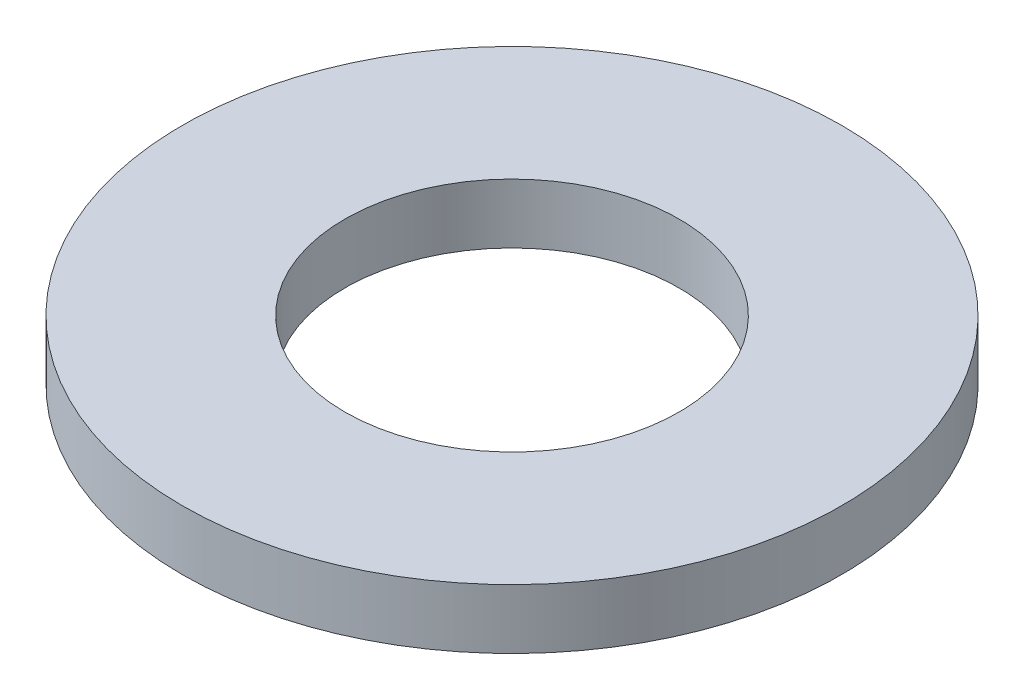
ISO-10303-21;
HEADER;
FILE_DESCRIPTION(('STEP AP214'),'2;1');
FILE_NAME('part.step','',(''),(''),'','','');
FILE_SCHEMA(('AUTOMOTIVE_DESIGN { 1 0 10303 214 1 1 1 1 }'));
ENDSEC;
DATA;
#1=APPLICATION_CONTEXT('core data for automotive mechanical design processes');
#2=APPLICATION_PROTOCOL_DEFINITION('international standard','automotive_design',2000,#1);
#3=PRODUCT_CONTEXT('',#1,'mechanical');
#4=PRODUCT('Part','Part','',(#3));
#5=PRODUCT_RELATED_PRODUCT_CATEGORY('part','',(#4));
#6=PRODUCT_DEFINITION_FORMATION('','',#4);
#7=PRODUCT_DEFINITION_CONTEXT('part definition',#1,'design');
#8=PRODUCT_DEFINITION('design','',#6,#7);
#9=PRODUCT_DEFINITION_SHAPE('','',#8);
#10=(LENGTH_UNIT() NAMED_UNIT(*) SI_UNIT(.MILLI.,.METRE.));
#11=(NAMED_UNIT(*) PLANE_ANGLE_UNIT() SI_UNIT($,.RADIAN.));
#12=(NAMED_UNIT(*) SI_UNIT($,.STERADIAN.) SOLID_ANGLE_UNIT());
#13=UNCERTAINTY_MEASURE_WITH_UNIT(LENGTH_MEASURE(1.E-05),#10,'distance_accuracy_value','');
#14=(GEOMETRIC_REPRESENTATION_CONTEXT(3) GLOBAL_UNCERTAINTY_ASSIGNED_CONTEXT((#13)) GLOBAL_UNIT_ASSIGNED_CONTEXT((#10,
#11,#12)) REPRESENTATION_CONTEXT('',''));
#15=CARTESIAN_POINT('',(0.,0.,0.));
#16=DIRECTION('',(0.,0.,1.));
#17=DIRECTION('',(1.,0.,0.));
#18=AXIS2_PLACEMENT_3D('',#15,#16,#17);
#19=CARTESIAN_POINT('',(0.,1.5875,0.));
#20=DIRECTION('',(0.,1.,0.));
#21=DIRECTION('',(0.,0.,1.));
#22=AXIS2_PLACEMENT_3D('',#19,#20,#21);
#23=PLANE('',#22);
#24=CARTESIAN_POINT('',(0.,1.5875,0.));
#25=DIRECTION('',(0.,1.,0.));
#26=DIRECTION('',(0.,0.,1.));
#27=AXIS2_PLACEMENT_3D('',#24,#25,#26);
#28=CIRCLE('',#27,8.763);
#29=CARTESIAN_POINT('',(0.,1.5875,8.763));
#30=VERTEX_POINT('',#29);
#31=EDGE_CURVE('E10',#30,#30,#28,.T.);
#32=ORIENTED_EDGE('',*,*,#31,.T.);
#33=EDGE_LOOP('',(#32));
#34=FACE_BOUND('',#33,.T.);
#35=CARTESIAN_POINT('',(0.,1.5875,0.));
#36=DIRECTION('',(0.,1.,0.));
#37=DIRECTION('',(0.,0.,1.));
#38=AXIS2_PLACEMENT_3D('',#35,#36,#37);
#39=CIRCLE('',#38,4.445);
#40=CARTESIAN_POINT('',(0.,1.5875,4.445));
#41=VERTEX_POINT('',#40);
#42=EDGE_CURVE('E40',#41,#41,#39,.T.);
#43=ORIENTED_EDGE('',*,*,#42,.F.);
#44=EDGE_LOOP('',(#43));
#45=FACE_BOUND('',#44,.T.);
#46=ADVANCED_FACE('F29',(#34,#45),#23,.T.);
#47=CARTESIAN_POINT('',(0.,0.,0.));
#48=DIRECTION('',(0.,1.,0.));
#49=DIRECTION('',(0.,0.,1.));
#50=AXIS2_PLACEMENT_3D('',#47,#48,#49);
#51=PLANE('',#50);
#52=CARTESIAN_POINT('',(0.,0.,0.));
#53=DIRECTION('',(0.,1.,0.));
#54=DIRECTION('',(0.,0.,1.));
#55=AXIS2_PLACEMENT_3D('',#52,#53,#54);
#56=CIRCLE('',#55,8.763);
#57=CARTESIAN_POINT('',(0.,0.,8.763));
#58=VERTEX_POINT('',#57);
#59=EDGE_CURVE('E36',#58,#58,#56,.T.);
#60=ORIENTED_EDGE('',*,*,#59,.F.);
#61=EDGE_LOOP('',(#60));
#62=FACE_BOUND('',#61,.T.);
#63=CARTESIAN_POINT('',(0.,0.,0.));
#64=DIRECTION('',(0.,1.,0.));
#65=DIRECTION('',(0.,0.,1.));
#66=AXIS2_PLACEMENT_3D('',#63,#64,#65);
#67=CIRCLE('',#66,4.445);
#68=CARTESIAN_POINT('',(0.,0.,4.445));
#69=VERTEX_POINT('',#68);
#70=EDGE_CURVE('E44',#69,#69,#67,.T.);
#71=ORIENTED_EDGE('',*,*,#70,.T.);
#72=EDGE_LOOP('',(#71));
#73=FACE_BOUND('',#72,.T.);
#74=ADVANCED_FACE('F50',(#62,#73),#51,.F.);
#75=CARTESIAN_POINT('',(0.,1.5875,0.));
#76=DIRECTION('',(0.,-1.,0.));
#77=DIRECTION('',(0.,0.,-1.));
#78=AXIS2_PLACEMENT_3D('',#75,#76,#77);
#79=CYLINDRICAL_SURFACE('',#78,8.763);
#80=ORIENTED_EDGE('',*,*,#31,.F.);
#81=EDGE_LOOP('',(#80));
#82=FACE_BOUND('',#81,.T.);
#83=ORIENTED_EDGE('',*,*,#59,.T.);
#84=EDGE_LOOP('',(#83));
#85=FACE_BOUND('',#84,.T.);
#86=ADVANCED_FACE('F31',(#82,#85),#79,.T.);
#87=CARTESIAN_POINT('',(0.,1.5875,0.));
#88=DIRECTION('',(0.,-1.,0.));
#89=DIRECTION('',(0.,0.,-1.));
#90=AXIS2_PLACEMENT_3D('',#87,#88,#89);
#91=CYLINDRICAL_SURFACE('',#90,4.445);
#92=ORIENTED_EDGE('',*,*,#42,.T.);
#93=EDGE_LOOP('',(#92));
#94=FACE_BOUND('',#93,.T.);
#95=ORIENTED_EDGE('',*,*,#70,.F.);
#96=EDGE_LOOP('',(#95));
#97=FACE_BOUND('',#96,.T.);
#98=ADVANCED_FACE('F52',(#94,#97),#91,.F.);
#99=CLOSED_SHELL('',(#46,#74,#86,#98));
#100=MANIFOLD_SOLID_BREP('B2',#99);
#101=ADVANCED_BREP_SHAPE_REPRESENTATION('',(#18,#100),#14);
#102=SHAPE_DEFINITION_REPRESENTATION(#9,#101);
ENDSEC;
END-ISO-10303-21;
